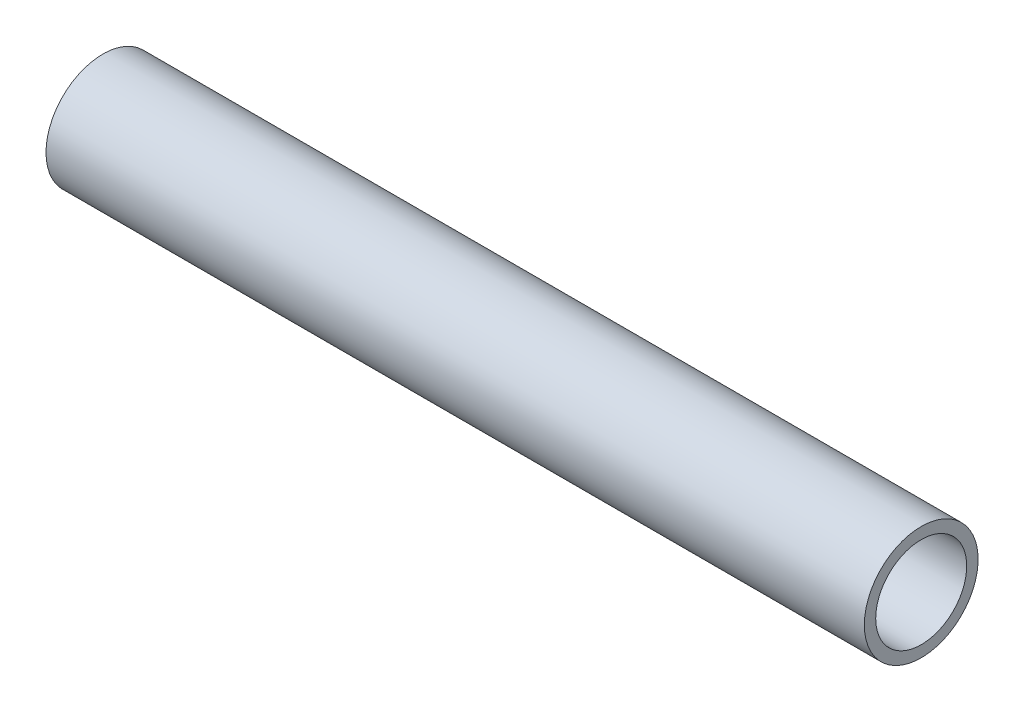
ISO-10303-21;
HEADER;
FILE_DESCRIPTION(('STEP AP214'),'2;1');
FILE_NAME('part.step','',(''),(''),'','','');
FILE_SCHEMA(('AUTOMOTIVE_DESIGN { 1 0 10303 214 1 1 1 1 }'));
ENDSEC;
DATA;
#1=APPLICATION_CONTEXT('core data for automotive mechanical design processes');
#2=APPLICATION_PROTOCOL_DEFINITION('international standard','automotive_design',2000,#1);
#3=PRODUCT_CONTEXT('',#1,'mechanical');
#4=PRODUCT('Part','Part','',(#3));
#5=PRODUCT_RELATED_PRODUCT_CATEGORY('part','',(#4));
#6=PRODUCT_DEFINITION_FORMATION('','',#4);
#7=PRODUCT_DEFINITION_CONTEXT('part definition',#1,'design');
#8=PRODUCT_DEFINITION('design','',#6,#7);
#9=PRODUCT_DEFINITION_SHAPE('','',#8);
#10=(LENGTH_UNIT() NAMED_UNIT(*) SI_UNIT(.MILLI.,.METRE.));
#11=(NAMED_UNIT(*) PLANE_ANGLE_UNIT() SI_UNIT($,.RADIAN.));
#12=(NAMED_UNIT(*) SI_UNIT($,.STERADIAN.) SOLID_ANGLE_UNIT());
#13=UNCERTAINTY_MEASURE_WITH_UNIT(LENGTH_MEASURE(1.E-05),#10,'distance_accuracy_value','');
#14=(GEOMETRIC_REPRESENTATION_CONTEXT(3) GLOBAL_UNCERTAINTY_ASSIGNED_CONTEXT((#13)) GLOBAL_UNIT_ASSIGNED_CONTEXT((#10,
#11,#12)) REPRESENTATION_CONTEXT('',''));
#15=CARTESIAN_POINT('',(0.,0.,0.));
#16=DIRECTION('',(0.,0.,1.));
#17=DIRECTION('',(1.,0.,0.));
#18=AXIS2_PLACEMENT_3D('',#15,#16,#17);
#19=CARTESIAN_POINT('',(114.173,0.,0.));
#20=DIRECTION('',(1.,0.,0.));
#21=DIRECTION('',(0.,0.,-1.));
#22=AXIS2_PLACEMENT_3D('',#19,#20,#21);
#23=PLANE('',#22);
#24=CARTESIAN_POINT('',(114.173,0.,0.));
#25=DIRECTION('',(1.,0.,0.));
#26=DIRECTION('',(0.,0.,-1.));
#27=AXIS2_PLACEMENT_3D('',#24,#25,#26);
#28=CIRCLE('',#27,15.875);
#29=CARTESIAN_POINT('',(114.173,0.,15.875));
#30=VERTEX_POINT('',#29);
#31=EDGE_CURVE('E11',#30,#30,#28,.T.);
#32=ORIENTED_EDGE('',*,*,#31,.T.);
#33=EDGE_LOOP('',(#32));
#34=FACE_BOUND('',#33,.T.);
#35=CARTESIAN_POINT('',(114.173,0.,0.));
#36=DIRECTION('',(1.,0.,0.));
#37=DIRECTION('',(0.,0.,-1.));
#38=AXIS2_PLACEMENT_3D('',#35,#36,#37);
#39=CIRCLE('',#38,12.7);
#40=CARTESIAN_POINT('',(114.173,0.,12.7));
#41=VERTEX_POINT('',#40);
#42=EDGE_CURVE('E52',#41,#41,#39,.T.);
#43=ORIENTED_EDGE('',*,*,#42,.F.);
#44=EDGE_LOOP('',(#43));
#45=FACE_BOUND('',#44,.T.);
#46=ADVANCED_FACE('F41',(#34,#45),#23,.T.);
#47=CARTESIAN_POINT('',(-114.173,0.,0.));
#48=DIRECTION('',(1.,0.,0.));
#49=DIRECTION('',(0.,0.,-1.));
#50=AXIS2_PLACEMENT_3D('',#47,#48,#49);
#51=PLANE('',#50);
#52=CARTESIAN_POINT('',(-114.173,0.,0.));
#53=DIRECTION('',(1.,0.,0.));
#54=DIRECTION('',(0.,0.,-1.));
#55=AXIS2_PLACEMENT_3D('',#52,#53,#54);
#56=CIRCLE('',#55,15.875);
#57=CARTESIAN_POINT('',(-114.173,0.,15.875));
#58=VERTEX_POINT('',#57);
#59=EDGE_CURVE('E45',#58,#58,#56,.T.);
#60=ORIENTED_EDGE('',*,*,#59,.F.);
#61=EDGE_LOOP('',(#60));
#62=FACE_BOUND('',#61,.T.);
#63=CARTESIAN_POINT('',(-114.173,0.,0.));
#64=DIRECTION('',(1.,0.,0.));
#65=DIRECTION('',(0.,0.,-1.));
#66=AXIS2_PLACEMENT_3D('',#63,#64,#65);
#67=CIRCLE('',#66,12.7);
#68=CARTESIAN_POINT('',(-114.173,0.,12.7));
#69=VERTEX_POINT('',#68);
#70=EDGE_CURVE('E54',#69,#69,#67,.T.);
#71=ORIENTED_EDGE('',*,*,#70,.T.);
#72=EDGE_LOOP('',(#71));
#73=FACE_BOUND('',#72,.T.);
#74=ADVANCED_FACE('F64',(#62,#73),#51,.F.);
#75=CARTESIAN_POINT('',(114.173,0.,0.));
#76=DIRECTION('',(-1.,0.,0.));
#77=DIRECTION('',(0.,0.,1.));
#78=AXIS2_PLACEMENT_3D('',#75,#76,#77);
#79=CYLINDRICAL_SURFACE('',#78,15.875);
#80=CARTESIAN_POINT('',(114.173,0.,15.875));
#81=CARTESIAN_POINT('',(111.794395833333,0.,15.875));
#82=CARTESIAN_POINT('',(109.415791666667,0.,15.875));
#83=CARTESIAN_POINT('',(104.658583333333,0.,15.875));
#84=CARTESIAN_POINT('',(102.279979166667,0.,15.875));
#85=CARTESIAN_POINT('',(97.5227708333333,0.,15.875));
#86=CARTESIAN_POINT('',(95.1441666666666,0.,15.875));
#87=CARTESIAN_POINT('',(90.3869583333333,0.,15.875));
#88=CARTESIAN_POINT('',(88.0083541666666,0.,15.875));
#89=CARTESIAN_POINT('',(83.2511458333333,0.,15.875));
#90=CARTESIAN_POINT('',(80.8725416666667,0.,15.875));
#91=CARTESIAN_POINT('',(76.1153333333333,0.,15.875));
#92=CARTESIAN_POINT('',(73.7367291666666,0.,15.875));
#93=CARTESIAN_POINT('',(68.9795208333333,0.,15.875));
#94=CARTESIAN_POINT('',(66.6009166666667,0.,15.875));
#95=CARTESIAN_POINT('',(61.8437083333333,0.,15.875));
#96=CARTESIAN_POINT('',(59.4651041666666,0.,15.875));
#97=CARTESIAN_POINT('',(54.7078958333333,0.,15.875));
#98=CARTESIAN_POINT('',(52.3292916666666,0.,15.875));
#99=CARTESIAN_POINT('',(47.5720833333333,0.,15.875));
#100=CARTESIAN_POINT('',(45.1934791666666,0.,15.875));
#101=CARTESIAN_POINT('',(40.4362708333333,0.,15.875));
#102=CARTESIAN_POINT('',(38.0576666666666,0.,15.875));
#103=CARTESIAN_POINT('',(33.3004583333333,0.,15.875));
#104=CARTESIAN_POINT('',(30.9218541666666,0.,15.875));
#105=CARTESIAN_POINT('',(26.1646458333333,0.,15.875));
#106=CARTESIAN_POINT('',(23.7860416666666,0.,15.875));
#107=CARTESIAN_POINT('',(19.0288333333333,0.,15.875));
#108=CARTESIAN_POINT('',(16.6502291666666,0.,15.875));
#109=CARTESIAN_POINT('',(11.8930208333333,0.,15.875));
#110=CARTESIAN_POINT('',(9.51441666666665,0.,15.875));
#111=CARTESIAN_POINT('',(4.75720833333331,0.,15.875));
#112=CARTESIAN_POINT('',(2.37860416666664,0.,15.875));
#113=CARTESIAN_POINT('',(-2.3786041666667,0.,15.875));
#114=CARTESIAN_POINT('',(-4.75720833333336,0.,15.875));
#115=CARTESIAN_POINT('',(-9.51441666666669,0.,15.875));
#116=CARTESIAN_POINT('',(-11.8930208333334,0.,15.875));
#117=CARTESIAN_POINT('',(-16.6502291666667,0.,15.875));
#118=CARTESIAN_POINT('',(-19.0288333333333,0.,15.875));
#119=CARTESIAN_POINT('',(-23.7860416666667,0.,15.875));
#120=CARTESIAN_POINT('',(-26.1646458333334,0.,15.875));
#121=CARTESIAN_POINT('',(-30.9218541666667,0.,15.875));
#122=CARTESIAN_POINT('',(-33.3004583333333,0.,15.875));
#123=CARTESIAN_POINT('',(-38.0576666666667,0.,15.875));
#124=CARTESIAN_POINT('',(-40.4362708333333,0.,15.875));
#125=CARTESIAN_POINT('',(-45.1934791666667,0.,15.875));
#126=CARTESIAN_POINT('',(-47.5720833333333,0.,15.875));
#127=CARTESIAN_POINT('',(-52.3292916666667,0.,15.875));
#128=CARTESIAN_POINT('',(-54.7078958333333,0.,15.875));
#129=CARTESIAN_POINT('',(-59.4651041666667,0.,15.875));
#130=CARTESIAN_POINT('',(-61.8437083333334,0.,15.875));
#131=CARTESIAN_POINT('',(-66.6009166666667,0.,15.875));
#132=CARTESIAN_POINT('',(-68.9795208333334,0.,15.875));
#133=CARTESIAN_POINT('',(-73.7367291666667,0.,15.875));
#134=CARTESIAN_POINT('',(-76.1153333333334,0.,15.875));
#135=CARTESIAN_POINT('',(-80.8725416666667,0.,15.875));
#136=CARTESIAN_POINT('',(-83.2511458333333,0.,15.875));
#137=CARTESIAN_POINT('',(-88.0083541666667,0.,15.875));
#138=CARTESIAN_POINT('',(-90.3869583333333,0.,15.875));
#139=CARTESIAN_POINT('',(-95.1441666666667,0.,15.875));
#140=CARTESIAN_POINT('',(-97.5227708333333,0.,15.875));
#141=CARTESIAN_POINT('',(-102.279979166667,0.,15.875));
#142=CARTESIAN_POINT('',(-104.658583333333,0.,15.875));
#143=CARTESIAN_POINT('',(-109.415791666667,0.,15.875));
#144=CARTESIAN_POINT('',(-111.794395833333,0.,15.875));
#145=CARTESIAN_POINT('',(-114.173,0.,15.875));
#146=B_SPLINE_CURVE_WITH_KNOTS('',3,(#80,#81,#82,#83,#84,#85,#86,#87,#88,#89,#90,#91,#92,#93,
#94,#95,#96,#97,#98,#99,#100,#101,#102,#103,#104,#105,#106,#107,#108,#109,#110,#111,#112,#113,
#114,#115,#116,#117,#118,#119,#120,#121,#122,#123,#124,#125,#126,#127,#128,#129,#130,#131,#132,
#133,#134,#135,#136,#137,#138,#139,#140,#141,#142,#143,#144,#145),.UNSPECIFIED.,.F.,.F.,(4,2,2,
2,2,2,2,2,2,2,2,2,2,2,2,2,2,2,2,2,2,2,2,2,2,2,2,2,2,2,2,2,4),(0.,7.13581249999999,14.271625,
21.4074375,28.54325,35.6790625,42.814875,49.9506875,57.0865,64.2223125,71.358125,78.4939375,
85.62975,92.7655625,99.901375,107.0371875,114.173,121.3088125,128.444625,135.5804375,142.71625,
149.8520625,156.987875,164.1236875,171.2595,178.3953125,185.531125,192.6669375,199.80275,
206.9385625,214.074375,221.2101875,228.346),.UNSPECIFIED.);
#147=EDGE_CURVE('BSEAM43',#30,#58,#146,.T.);
#148=ORIENTED_EDGE('',*,*,#31,.F.);
#149=ORIENTED_EDGE('',*,*,#59,.T.);
#150=ORIENTED_EDGE('',*,*,#147,.T.);
#151=ORIENTED_EDGE('',*,*,#147,.F.);
#152=EDGE_LOOP('',(#148,#150,#149,#151));
#153=FACE_BOUND('',#152,.T.);
#154=ADVANCED_FACE('F43',(#153),#79,.T.);
#155=CARTESIAN_POINT('',(114.173,0.,0.));
#156=DIRECTION('',(-1.,0.,0.));
#157=DIRECTION('',(0.,0.,1.));
#158=AXIS2_PLACEMENT_3D('',#155,#156,#157);
#159=CYLINDRICAL_SURFACE('',#158,12.7);
#160=CARTESIAN_POINT('',(114.173,0.,12.7));
#161=CARTESIAN_POINT('',(111.794395833333,0.,12.7));
#162=CARTESIAN_POINT('',(109.415791666667,0.,12.7));
#163=CARTESIAN_POINT('',(104.658583333333,0.,12.7));
#164=CARTESIAN_POINT('',(102.279979166667,0.,12.7));
#165=CARTESIAN_POINT('',(97.5227708333333,0.,12.7));
#166=CARTESIAN_POINT('',(95.1441666666666,0.,12.7));
#167=CARTESIAN_POINT('',(90.3869583333333,0.,12.7));
#168=CARTESIAN_POINT('',(88.0083541666666,0.,12.7));
#169=CARTESIAN_POINT('',(83.2511458333333,0.,12.7));
#170=CARTESIAN_POINT('',(80.8725416666667,0.,12.7));
#171=CARTESIAN_POINT('',(76.1153333333333,0.,12.7));
#172=CARTESIAN_POINT('',(73.7367291666666,0.,12.7));
#173=CARTESIAN_POINT('',(68.9795208333333,0.,12.7));
#174=CARTESIAN_POINT('',(66.6009166666667,0.,12.7));
#175=CARTESIAN_POINT('',(61.8437083333333,0.,12.7));
#176=CARTESIAN_POINT('',(59.4651041666666,0.,12.7));
#177=CARTESIAN_POINT('',(54.7078958333333,0.,12.7));
#178=CARTESIAN_POINT('',(52.3292916666667,0.,12.7));
#179=CARTESIAN_POINT('',(47.5720833333333,0.,12.7));
#180=CARTESIAN_POINT('',(45.1934791666667,0.,12.7));
#181=CARTESIAN_POINT('',(40.4362708333333,0.,12.7));
#182=CARTESIAN_POINT('',(38.0576666666667,0.,12.7));
#183=CARTESIAN_POINT('',(33.3004583333333,0.,12.7));
#184=CARTESIAN_POINT('',(30.9218541666667,0.,12.7));
#185=CARTESIAN_POINT('',(26.1646458333333,0.,12.7));
#186=CARTESIAN_POINT('',(23.7860416666667,0.,12.7));
#187=CARTESIAN_POINT('',(19.0288333333333,0.,12.7));
#188=CARTESIAN_POINT('',(16.6502291666667,0.,12.7));
#189=CARTESIAN_POINT('',(11.8930208333333,0.,12.7));
#190=CARTESIAN_POINT('',(9.51441666666666,0.,12.7));
#191=CARTESIAN_POINT('',(4.75720833333332,0.,12.7));
#192=CARTESIAN_POINT('',(2.37860416666665,0.,12.7));
#193=CARTESIAN_POINT('',(-2.37860416666668,0.,12.7));
#194=CARTESIAN_POINT('',(-4.75720833333335,0.,12.7));
#195=CARTESIAN_POINT('',(-9.51441666666668,0.,12.7));
#196=CARTESIAN_POINT('',(-11.8930208333333,0.,12.7));
#197=CARTESIAN_POINT('',(-16.6502291666667,0.,12.7));
#198=CARTESIAN_POINT('',(-19.0288333333333,0.,12.7));
#199=CARTESIAN_POINT('',(-23.7860416666667,0.,12.7));
#200=CARTESIAN_POINT('',(-26.1646458333333,0.,12.7));
#201=CARTESIAN_POINT('',(-30.9218541666667,0.,12.7));
#202=CARTESIAN_POINT('',(-33.3004583333333,0.,12.7));
#203=CARTESIAN_POINT('',(-38.0576666666667,0.,12.7));
#204=CARTESIAN_POINT('',(-40.4362708333333,0.,12.7));
#205=CARTESIAN_POINT('',(-45.1934791666667,0.,12.7));
#206=CARTESIAN_POINT('',(-47.5720833333333,0.,12.7));
#207=CARTESIAN_POINT('',(-52.3292916666667,0.,12.7));
#208=CARTESIAN_POINT('',(-54.7078958333333,0.,12.7));
#209=CARTESIAN_POINT('',(-59.4651041666667,0.,12.7));
#210=CARTESIAN_POINT('',(-61.8437083333334,0.,12.7));
#211=CARTESIAN_POINT('',(-66.6009166666667,0.,12.7));
#212=CARTESIAN_POINT('',(-68.9795208333334,0.,12.7));
#213=CARTESIAN_POINT('',(-73.7367291666667,0.,12.7));
#214=CARTESIAN_POINT('',(-76.1153333333334,0.,12.7));
#215=CARTESIAN_POINT('',(-80.8725416666667,0.,12.7));
#216=CARTESIAN_POINT('',(-83.2511458333333,0.,12.7));
#217=CARTESIAN_POINT('',(-88.0083541666667,0.,12.7));
#218=CARTESIAN_POINT('',(-90.3869583333333,0.,12.7));
#219=CARTESIAN_POINT('',(-95.1441666666667,0.,12.7));
#220=CARTESIAN_POINT('',(-97.5227708333333,0.,12.7));
#221=CARTESIAN_POINT('',(-102.279979166667,0.,12.7));
#222=CARTESIAN_POINT('',(-104.658583333333,0.,12.7));
#223=CARTESIAN_POINT('',(-109.415791666667,0.,12.7));
#224=CARTESIAN_POINT('',(-111.794395833333,0.,12.7));
#225=CARTESIAN_POINT('',(-114.173,0.,12.7));
#226=B_SPLINE_CURVE_WITH_KNOTS('',3,(#160,#161,#162,#163,#164,#165,#166,#167,#168,#169,#170,
#171,#172,#173,#174,#175,#176,#177,#178,#179,#180,#181,#182,#183,#184,#185,#186,#187,#188,#189,
#190,#191,#192,#193,#194,#195,#196,#197,#198,#199,#200,#201,#202,#203,#204,#205,#206,#207,#208,
#209,#210,#211,#212,#213,#214,#215,#216,#217,#218,#219,#220,#221,#222,#223,#224,#225),
.UNSPECIFIED.,.F.,.F.,(4,2,2,2,2,2,2,2,2,2,2,2,2,2,2,2,2,2,2,2,2,2,2,2,2,2,2,2,2,2,2,2,4),(0.,
7.13581250000001,14.271625,21.4074375,28.54325,35.6790625,42.814875,49.9506875,57.0865,
64.2223125,71.358125,78.4939375,85.62975,92.7655625,99.901375,107.0371875,114.173,121.3088125,
128.444625,135.5804375,142.71625,149.8520625,156.987875,164.1236875,171.2595,178.3953125,
185.531125,192.6669375,199.80275,206.9385625,214.074375,221.2101875,228.346),.UNSPECIFIED.);
#227=EDGE_CURVE('BSEAM60',#41,#69,#226,.T.);
#228=ORIENTED_EDGE('',*,*,#42,.T.);
#229=ORIENTED_EDGE('',*,*,#70,.F.);
#230=ORIENTED_EDGE('',*,*,#227,.T.);
#231=ORIENTED_EDGE('',*,*,#227,.F.);
#232=EDGE_LOOP('',(#228,#230,#229,#231));
#233=FACE_BOUND('',#232,.T.);
#234=ADVANCED_FACE('F60',(#233),#159,.F.);
#235=CLOSED_SHELL('',(#46,#74,#154,#234));
#236=MANIFOLD_SOLID_BREP('B2',#235);
#237=ADVANCED_BREP_SHAPE_REPRESENTATION('',(#18,#236),#14);
#238=SHAPE_DEFINITION_REPRESENTATION(#9,#237);
ENDSEC;
END-ISO-10303-21;
